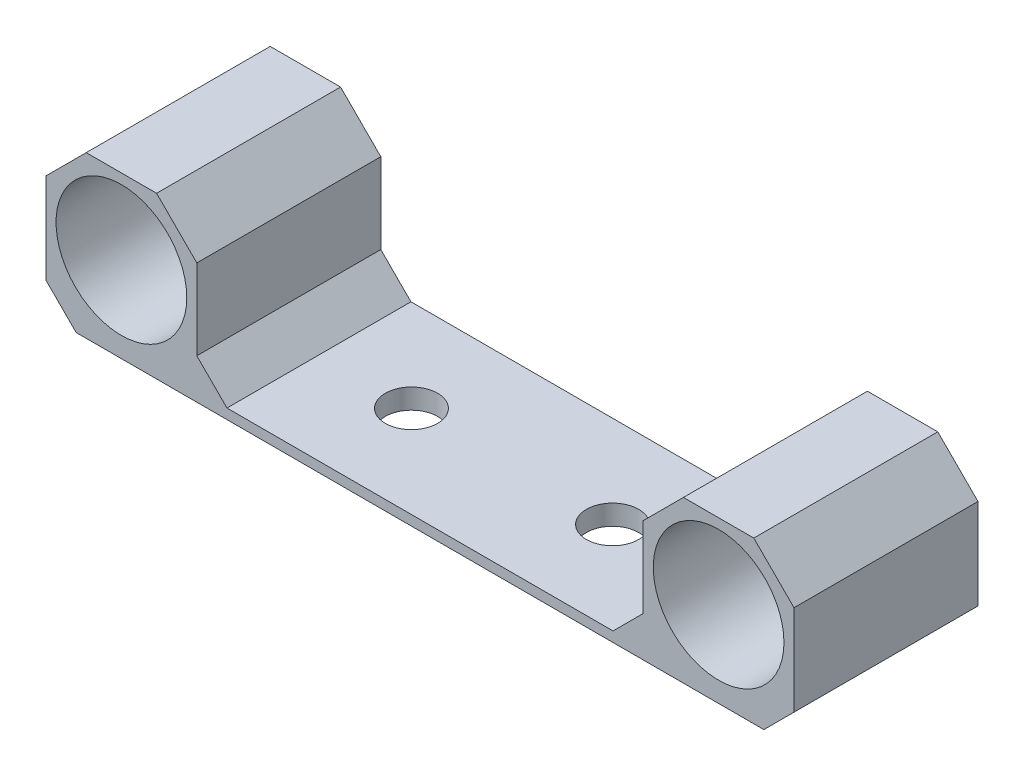
ISO-10303-21;
HEADER;
FILE_DESCRIPTION(('STEP AP214'),'2;1');
FILE_NAME('part.step','',(''),(''),'','','');
FILE_SCHEMA(('AUTOMOTIVE_DESIGN { 1 0 10303 214 1 1 1 1 }'));
ENDSEC;
DATA;
#1=APPLICATION_CONTEXT('core data for automotive mechanical design processes');
#2=APPLICATION_PROTOCOL_DEFINITION('international standard','automotive_design',2000,#1);
#3=PRODUCT_CONTEXT('',#1,'mechanical');
#4=PRODUCT('Part','Part','',(#3));
#5=PRODUCT_RELATED_PRODUCT_CATEGORY('part','',(#4));
#6=PRODUCT_DEFINITION_FORMATION('','',#4);
#7=PRODUCT_DEFINITION_CONTEXT('part definition',#1,'design');
#8=PRODUCT_DEFINITION('design','',#6,#7);
#9=PRODUCT_DEFINITION_SHAPE('','',#8);
#10=(LENGTH_UNIT() NAMED_UNIT(*) SI_UNIT(.MILLI.,.METRE.));
#11=(NAMED_UNIT(*) PLANE_ANGLE_UNIT() SI_UNIT($,.RADIAN.));
#12=(NAMED_UNIT(*) SI_UNIT($,.STERADIAN.) SOLID_ANGLE_UNIT());
#13=UNCERTAINTY_MEASURE_WITH_UNIT(LENGTH_MEASURE(1.E-05),#10,'distance_accuracy_value','');
#14=(GEOMETRIC_REPRESENTATION_CONTEXT(3) GLOBAL_UNCERTAINTY_ASSIGNED_CONTEXT((#13)) GLOBAL_UNIT_ASSIGNED_CONTEXT((#10,
#11,#12)) REPRESENTATION_CONTEXT('',''));
#15=CARTESIAN_POINT('',(0.,0.,0.));
#16=DIRECTION('',(0.,0.,1.));
#17=DIRECTION('',(1.,0.,0.));
#18=AXIS2_PLACEMENT_3D('',#15,#16,#17);
#19=CARTESIAN_POINT('',(0.,2.,0.));
#20=DIRECTION('',(0.,1.,0.));
#21=DIRECTION('',(0.,0.,1.));
#22=AXIS2_PLACEMENT_3D('',#19,#20,#21);
#23=PLANE('',#22);
#24=CARTESIAN_POINT('',(32.2,2.,-9.15));
#25=DIRECTION('',(0.,1.,0.));
#26=DIRECTION('',(0.,0.,1.));
#27=AXIS2_PLACEMENT_3D('',#24,#25,#26);
#28=CIRCLE('',#27,2.6);
#29=CARTESIAN_POINT('',(32.2,2.,-6.55));
#30=VERTEX_POINT('',#29);
#31=EDGE_CURVE('E411',#30,#30,#28,.T.);
#32=ORIENTED_EDGE('',*,*,#31,.F.);
#33=EDGE_LOOP('',(#32));
#34=FACE_BOUND('',#33,.T.);
#35=CARTESIAN_POINT('',(12.2,2.,-9.15));
#36=DIRECTION('',(0.,1.,0.));
#37=DIRECTION('',(0.,0.,1.));
#38=AXIS2_PLACEMENT_3D('',#35,#36,#37);
#39=CIRCLE('',#38,2.6);
#40=CARTESIAN_POINT('',(12.2,2.,-6.55));
#41=VERTEX_POINT('',#40);
#42=EDGE_CURVE('E415',#41,#41,#39,.T.);
#43=ORIENTED_EDGE('',*,*,#42,.F.);
#44=EDGE_LOOP('',(#43));
#45=FACE_BOUND('',#44,.T.);
#46=DIRECTION('',(-1.,0.,0.));
#47=VECTOR('',#46,1.);
#48=CARTESIAN_POINT('',(0.,2.,0.));
#49=LINE('',#48,#47);
#50=CARTESIAN_POINT('',(41.4,2.,0.));
#51=VERTEX_POINT('',#50);
#52=CARTESIAN_POINT('',(3.,2.,0.));
#53=VERTEX_POINT('',#52);
#54=EDGE_CURVE('E402',#51,#53,#49,.T.);
#55=ORIENTED_EDGE('',*,*,#54,.F.);
#56=DIRECTION('',(0.,0.,-1.));
#57=VECTOR('',#56,1.);
#58=CARTESIAN_POINT('',(41.4,2.,-18.3));
#59=LINE('',#58,#57);
#60=CARTESIAN_POINT('',(41.4,2.,-18.3));
#61=VERTEX_POINT('',#60);
#62=EDGE_CURVE('E298',#51,#61,#59,.T.);
#63=ORIENTED_EDGE('',*,*,#62,.T.);
#64=DIRECTION('',(-1.,0.,0.));
#65=VECTOR('',#64,1.);
#66=CARTESIAN_POINT('',(0.,2.,-18.3));
#67=LINE('',#66,#65);
#68=CARTESIAN_POINT('',(3.,2.,-18.3));
#69=VERTEX_POINT('',#68);
#70=EDGE_CURVE('E406',#61,#69,#67,.T.);
#71=ORIENTED_EDGE('',*,*,#70,.T.);
#72=DIRECTION('',(0.,0.,1.));
#73=VECTOR('',#72,1.);
#74=CARTESIAN_POINT('',(3.,2.,0.));
#75=LINE('',#74,#73);
#76=EDGE_CURVE('E294',#69,#53,#75,.T.);
#77=ORIENTED_EDGE('',*,*,#76,.T.);
#78=EDGE_LOOP('',(#55,#63,#71,#77));
#79=FACE_BOUND('',#78,.T.);
#80=ADVANCED_FACE('F59',(#34,#45,#79),#23,.T.);
#81=CARTESIAN_POINT('',(-15.,2.,0.));
#82=DIRECTION('',(-1.,0.,0.));
#83=DIRECTION('',(0.,0.,1.));
#84=AXIS2_PLACEMENT_3D('',#81,#82,#83);
#85=PLANE('',#84);
#86=DIRECTION('',(0.,-1.,0.));
#87=VECTOR('',#86,1.);
#88=CARTESIAN_POINT('',(-15.,2.,-18.3));
#89=LINE('',#88,#87);
#90=CARTESIAN_POINT('',(-15.,13.,-18.3));
#91=VERTEX_POINT('',#90);
#92=CARTESIAN_POINT('',(-15.,4.,-18.3));
#93=VERTEX_POINT('',#92);
#94=EDGE_CURVE('E211',#91,#93,#89,.T.);
#95=ORIENTED_EDGE('',*,*,#94,.T.);
#96=DIRECTION('',(0.,0.,1.));
#97=VECTOR('',#96,1.);
#98=CARTESIAN_POINT('',(-15.,4.,0.));
#99=LINE('',#98,#97);
#100=CARTESIAN_POINT('',(-15.,4.,0.));
#101=VERTEX_POINT('',#100);
#102=EDGE_CURVE('E277',#93,#101,#99,.T.);
#103=ORIENTED_EDGE('',*,*,#102,.T.);
#104=DIRECTION('',(0.,-1.,0.));
#105=VECTOR('',#104,1.);
#106=CARTESIAN_POINT('',(-15.,2.,0.));
#107=LINE('',#106,#105);
#108=CARTESIAN_POINT('',(-15.,13.,0.));
#109=VERTEX_POINT('',#108);
#110=EDGE_CURVE('E217',#109,#101,#107,.T.);
#111=ORIENTED_EDGE('',*,*,#110,.F.);
#112=DIRECTION('',(0.,0.,-1.));
#113=VECTOR('',#112,1.);
#114=CARTESIAN_POINT('',(-15.,13.,0.));
#115=LINE('',#114,#113);
#116=EDGE_CURVE('E273',#109,#91,#115,.T.);
#117=ORIENTED_EDGE('',*,*,#116,.T.);
#118=EDGE_LOOP('',(#95,#103,#111,#117));
#119=FACE_BOUND('',#118,.T.);
#120=ADVANCED_FACE('F359',(#119),#85,.T.);
#121=CARTESIAN_POINT('',(0.,2.,0.));
#122=DIRECTION('',(0.,0.,1.));
#123=DIRECTION('',(1.,0.,0.));
#124=AXIS2_PLACEMENT_3D('',#121,#122,#123);
#125=PLANE('',#124);
#126=CARTESIAN_POINT('',(-7.5,9.5,0.));
#127=DIRECTION('',(0.,0.,1.));
#128=DIRECTION('',(1.,0.,0.));
#129=AXIS2_PLACEMENT_3D('',#126,#127,#128);
#130=CIRCLE('',#129,6.5);
#131=CARTESIAN_POINT('',(-0.999999999999999,9.5,0.));
#132=VERTEX_POINT('',#131);
#133=EDGE_CURVE('E762',#132,#132,#130,.T.);
#134=ORIENTED_EDGE('',*,*,#133,.F.);
#135=EDGE_LOOP('',(#134));
#136=FACE_BOUND('',#135,.T.);
#137=CARTESIAN_POINT('',(51.9,9.5,0.));
#138=DIRECTION('',(0.,0.,1.));
#139=DIRECTION('',(1.,0.,0.));
#140=AXIS2_PLACEMENT_3D('',#137,#138,#139);
#141=CIRCLE('',#140,6.5);
#142=CARTESIAN_POINT('',(58.4,9.5,0.));
#143=VERTEX_POINT('',#142);
#144=EDGE_CURVE('E766',#143,#143,#141,.T.);
#145=ORIENTED_EDGE('',*,*,#144,.F.);
#146=EDGE_LOOP('',(#145));
#147=FACE_BOUND('',#146,.T.);
#148=DIRECTION('',(0.707106781186548,-0.707106781186548,0.));
#149=VECTOR('',#148,1.);
#150=CARTESIAN_POINT('',(-6.5,-4.5,0.));
#151=LINE('',#150,#149);
#152=CARTESIAN_POINT('',(-12.,1.00000000000001,0.));
#153=VERTEX_POINT('',#152);
#154=EDGE_CURVE('E252',#101,#153,#151,.T.);
#155=ORIENTED_EDGE('',*,*,#154,.T.);
#156=DIRECTION('',(1.,0.,0.));
#157=VECTOR('',#156,1.);
#158=CARTESIAN_POINT('',(55.4,1.00000000000001,0.));
#159=LINE('',#158,#157);
#160=CARTESIAN_POINT('',(56.4,1.00000000000001,0.));
#161=VERTEX_POINT('',#160);
#162=EDGE_CURVE('E14',#153,#161,#159,.T.);
#163=ORIENTED_EDGE('',*,*,#162,.T.);
#164=DIRECTION('',(-0.707106781186547,-0.707106781186548,0.));
#165=VECTOR('',#164,1.);
#166=CARTESIAN_POINT('',(28.7,-26.7,0.));
#167=LINE('',#166,#165);
#168=CARTESIAN_POINT('',(59.4,4.,0.));
#169=VERTEX_POINT('',#168);
#170=EDGE_CURVE('E260',#161,#169,#167,.F.);
#171=ORIENTED_EDGE('',*,*,#170,.T.);
#172=DIRECTION('',(0.,-1.,0.));
#173=VECTOR('',#172,1.);
#174=CARTESIAN_POINT('',(59.4,2.,0.));
#175=LINE('',#174,#173);
#176=CARTESIAN_POINT('',(59.4,13.,0.));
#177=VERTEX_POINT('',#176);
#178=EDGE_CURVE('E210',#177,#169,#175,.T.);
#179=ORIENTED_EDGE('',*,*,#178,.F.);
#180=DIRECTION('',(-0.707106781186547,0.707106781186548,0.));
#181=VECTOR('',#180,1.);
#182=CARTESIAN_POINT('',(35.2,37.2,0.));
#183=LINE('',#182,#181);
#184=CARTESIAN_POINT('',(55.4,17.,0.));
#185=VERTEX_POINT('',#184);
#186=EDGE_CURVE('E215',#177,#185,#183,.T.);
#187=ORIENTED_EDGE('',*,*,#186,.T.);
#188=DIRECTION('',(1.,0.,0.));
#189=VECTOR('',#188,1.);
#190=CARTESIAN_POINT('',(0.,17.,0.));
#191=LINE('',#190,#189);
#192=CARTESIAN_POINT('',(48.4,17.,0.));
#193=VERTEX_POINT('',#192);
#194=EDGE_CURVE('E387',#193,#185,#191,.T.);
#195=ORIENTED_EDGE('',*,*,#194,.F.);
#196=DIRECTION('',(0.707106781186547,0.707106781186548,0.));
#197=VECTOR('',#196,1.);
#198=CARTESIAN_POINT('',(16.7,-14.7,0.));
#199=LINE('',#198,#197);
#200=CARTESIAN_POINT('',(44.4,13.,0.));
#201=VERTEX_POINT('',#200);
#202=EDGE_CURVE('E255',#193,#201,#199,.F.);
#203=ORIENTED_EDGE('',*,*,#202,.T.);
#204=DIRECTION('',(0.,-1.,0.));
#205=VECTOR('',#204,1.);
#206=CARTESIAN_POINT('',(44.4,17.,0.));
#207=LINE('',#206,#205);
#208=CARTESIAN_POINT('',(44.4,5.,0.));
#209=VERTEX_POINT('',#208);
#210=EDGE_CURVE('E393',#201,#209,#207,.T.);
#211=ORIENTED_EDGE('',*,*,#210,.T.);
#212=DIRECTION('',(0.707106781186548,0.707106781186547,0.));
#213=VECTOR('',#212,1.);
#214=CARTESIAN_POINT('',(44.4,5.,0.));
#215=LINE('',#214,#213);
#216=EDGE_CURVE('E304',#209,#51,#215,.F.);
#217=ORIENTED_EDGE('',*,*,#216,.T.);
#218=ORIENTED_EDGE('',*,*,#54,.T.);
#219=DIRECTION('',(-0.707106781186547,0.707106781186548,0.));
#220=VECTOR('',#219,1.);
#221=CARTESIAN_POINT('',(3.,2.,0.));
#222=LINE('',#221,#220);
#223=CARTESIAN_POINT('',(0.,5.,0.));
#224=VERTEX_POINT('',#223);
#225=EDGE_CURVE('E310',#53,#224,#222,.T.);
#226=ORIENTED_EDGE('',*,*,#225,.T.);
#227=DIRECTION('',(0.,-1.,0.));
#228=VECTOR('',#227,1.);
#229=CARTESIAN_POINT('',(0.,17.,0.));
#230=LINE('',#229,#228);
#231=CARTESIAN_POINT('',(0.,13.,0.));
#232=VERTEX_POINT('',#231);
#233=EDGE_CURVE('E378',#232,#224,#230,.T.);
#234=ORIENTED_EDGE('',*,*,#233,.F.);
#235=DIRECTION('',(-0.707106781186548,0.707106781186548,0.));
#236=VECTOR('',#235,1.);
#237=CARTESIAN_POINT('',(5.5,7.5,0.));
#238=LINE('',#237,#236);
#239=CARTESIAN_POINT('',(-4.,17.,0.));
#240=VERTEX_POINT('',#239);
#241=EDGE_CURVE('E249',#232,#240,#238,.T.);
#242=ORIENTED_EDGE('',*,*,#241,.T.);
#243=DIRECTION('',(-1.,0.,0.));
#244=VECTOR('',#243,1.);
#245=CARTESIAN_POINT('',(0.,17.,0.));
#246=LINE('',#245,#244);
#247=CARTESIAN_POINT('',(-11.,17.,0.));
#248=VERTEX_POINT('',#247);
#249=EDGE_CURVE('E373',#240,#248,#246,.T.);
#250=ORIENTED_EDGE('',*,*,#249,.T.);
#251=DIRECTION('',(0.707106781186548,0.707106781186548,0.));
#252=VECTOR('',#251,1.);
#253=CARTESIAN_POINT('',(-13.,15.,0.));
#254=LINE('',#253,#252);
#255=EDGE_CURVE('E246',#248,#109,#254,.F.);
#256=ORIENTED_EDGE('',*,*,#255,.T.);
#257=ORIENTED_EDGE('',*,*,#110,.T.);
#258=EDGE_LOOP('',(#155,#163,#171,#179,#187,#195,#203,#211,#217,#218,#226,#234,#242,#250,#256,#257));
#259=FACE_BOUND('',#258,.T.);
#260=ADVANCED_FACE('F352',(#136,#147,#259),#125,.T.);
#261=CARTESIAN_POINT('',(59.4,2.,0.));
#262=DIRECTION('',(-1.,0.,0.));
#263=DIRECTION('',(0.,0.,1.));
#264=AXIS2_PLACEMENT_3D('',#261,#262,#263);
#265=PLANE('',#264);
#266=ORIENTED_EDGE('',*,*,#178,.T.);
#267=DIRECTION('',(0.,0.,-1.));
#268=VECTOR('',#267,1.);
#269=CARTESIAN_POINT('',(59.4,4.,0.));
#270=LINE('',#269,#268);
#271=CARTESIAN_POINT('',(59.4,4.,-18.3));
#272=VERTEX_POINT('',#271);
#273=EDGE_CURVE('E208',#169,#272,#270,.T.);
#274=ORIENTED_EDGE('',*,*,#273,.T.);
#275=DIRECTION('',(0.,-1.,0.));
#276=VECTOR('',#275,1.);
#277=CARTESIAN_POINT('',(59.4,2.,-18.3));
#278=LINE('',#277,#276);
#279=CARTESIAN_POINT('',(59.4,13.,-18.3));
#280=VERTEX_POINT('',#279);
#281=EDGE_CURVE('E190',#280,#272,#278,.T.);
#282=ORIENTED_EDGE('',*,*,#281,.F.);
#283=DIRECTION('',(0.,0.,1.));
#284=VECTOR('',#283,1.);
#285=CARTESIAN_POINT('',(59.4,13.,0.));
#286=LINE('',#285,#284);
#287=EDGE_CURVE('E205',#280,#177,#286,.T.);
#288=ORIENTED_EDGE('',*,*,#287,.T.);
#289=EDGE_LOOP('',(#266,#274,#282,#288));
#290=FACE_BOUND('',#289,.T.);
#291=ADVANCED_FACE('F204',(#290),#265,.F.);
#292=CARTESIAN_POINT('',(32.2,2.,-9.15));
#293=DIRECTION('',(0.,-1.,0.));
#294=DIRECTION('',(0.,0.,-1.));
#295=AXIS2_PLACEMENT_3D('',#292,#293,#294);
#296=CYLINDRICAL_SURFACE('',#295,2.6);
#297=ORIENTED_EDGE('',*,*,#31,.T.);
#298=EDGE_LOOP('',(#297));
#299=FACE_BOUND('',#298,.T.);
#300=CARTESIAN_POINT('',(32.2,0.,-9.15));
#301=DIRECTION('',(0.,1.,0.));
#302=DIRECTION('',(0.,0.,1.));
#303=AXIS2_PLACEMENT_3D('',#300,#301,#302);
#304=CIRCLE('',#303,2.6);
#305=CARTESIAN_POINT('',(32.2,0.,-6.55));
#306=VERTEX_POINT('',#305);
#307=EDGE_CURVE('E401',#306,#306,#304,.T.);
#308=ORIENTED_EDGE('',*,*,#307,.F.);
#309=EDGE_LOOP('',(#308));
#310=FACE_BOUND('',#309,.T.);
#311=ADVANCED_FACE('F489',(#299,#310),#296,.F.);
#312=CARTESIAN_POINT('',(0.,2.,-18.3));
#313=DIRECTION('',(0.,0.,1.));
#314=DIRECTION('',(1.,0.,0.));
#315=AXIS2_PLACEMENT_3D('',#312,#313,#314);
#316=PLANE('',#315);
#317=DIRECTION('',(0.707106781186547,0.707106781186548,0.));
#318=VECTOR('',#317,1.);
#319=CARTESIAN_POINT('',(59.4,4.,-18.3));
#320=LINE('',#319,#318);
#321=CARTESIAN_POINT('',(56.4,1.00000000000001,-18.3));
#322=VERTEX_POINT('',#321);
#323=EDGE_CURVE('E198',#272,#322,#320,.F.);
#324=ORIENTED_EDGE('',*,*,#323,.T.);
#325=DIRECTION('',(-1.,0.,0.));
#326=VECTOR('',#325,1.);
#327=CARTESIAN_POINT('',(0.,1.00000000000001,-18.3));
#328=LINE('',#327,#326);
#329=CARTESIAN_POINT('',(-12.,1.00000000000002,-18.3));
#330=VERTEX_POINT('',#329);
#331=EDGE_CURVE('E316',#322,#330,#328,.T.);
#332=ORIENTED_EDGE('',*,*,#331,.T.);
#333=DIRECTION('',(-0.707106781186548,0.707106781186548,0.));
#334=VECTOR('',#333,1.);
#335=CARTESIAN_POINT('',(-11.,0.,-18.3));
#336=LINE('',#335,#334);
#337=EDGE_CURVE('E232',#330,#93,#336,.T.);
#338=ORIENTED_EDGE('',*,*,#337,.T.);
#339=ORIENTED_EDGE('',*,*,#94,.F.);
#340=DIRECTION('',(-0.707106781186548,-0.707106781186548,0.));
#341=VECTOR('',#340,1.);
#342=CARTESIAN_POINT('',(-15.,13.,-18.3));
#343=LINE('',#342,#341);
#344=CARTESIAN_POINT('',(-11.,17.,-18.3));
#345=VERTEX_POINT('',#344);
#346=EDGE_CURVE('E221',#91,#345,#343,.F.);
#347=ORIENTED_EDGE('',*,*,#346,.T.);
#348=DIRECTION('',(-1.,0.,0.));
#349=VECTOR('',#348,1.);
#350=CARTESIAN_POINT('',(0.,17.,-18.3));
#351=LINE('',#350,#349);
#352=CARTESIAN_POINT('',(-4.,17.,-18.3));
#353=VERTEX_POINT('',#352);
#354=EDGE_CURVE('E366',#353,#345,#351,.T.);
#355=ORIENTED_EDGE('',*,*,#354,.F.);
#356=DIRECTION('',(0.707106781186548,-0.707106781186548,0.));
#357=VECTOR('',#356,1.);
#358=CARTESIAN_POINT('',(-4.,17.,-18.3));
#359=LINE('',#358,#357);
#360=CARTESIAN_POINT('',(0.,13.,-18.3));
#361=VERTEX_POINT('',#360);
#362=EDGE_CURVE('E229',#353,#361,#359,.T.);
#363=ORIENTED_EDGE('',*,*,#362,.T.);
#364=DIRECTION('',(0.,-1.,0.));
#365=VECTOR('',#364,1.);
#366=CARTESIAN_POINT('',(0.,17.,-18.3));
#367=LINE('',#366,#365);
#368=CARTESIAN_POINT('',(0.,5.,-18.3));
#369=VERTEX_POINT('',#368);
#370=EDGE_CURVE('E372',#361,#369,#367,.T.);
#371=ORIENTED_EDGE('',*,*,#370,.T.);
#372=DIRECTION('',(0.707106781186547,-0.707106781186548,0.));
#373=VECTOR('',#372,1.);
#374=CARTESIAN_POINT('',(1.5,3.5,-18.3));
#375=LINE('',#374,#373);
#376=EDGE_CURVE('E313',#369,#69,#375,.T.);
#377=ORIENTED_EDGE('',*,*,#376,.T.);
#378=ORIENTED_EDGE('',*,*,#70,.F.);
#379=DIRECTION('',(-0.707106781186548,-0.707106781186547,0.));
#380=VECTOR('',#379,1.);
#381=CARTESIAN_POINT('',(20.7,-18.7,-18.3));
#382=LINE('',#381,#380);
#383=CARTESIAN_POINT('',(44.4,5.,-18.3));
#384=VERTEX_POINT('',#383);
#385=EDGE_CURVE('E307',#61,#384,#382,.F.);
#386=ORIENTED_EDGE('',*,*,#385,.T.);
#387=DIRECTION('',(0.,-1.,0.));
#388=VECTOR('',#387,1.);
#389=CARTESIAN_POINT('',(44.4,17.,-18.3));
#390=LINE('',#389,#388);
#391=CARTESIAN_POINT('',(44.4,13.,-18.3));
#392=VERTEX_POINT('',#391);
#393=EDGE_CURVE('E397',#392,#384,#390,.T.);
#394=ORIENTED_EDGE('',*,*,#393,.F.);
#395=DIRECTION('',(-0.707106781186547,-0.707106781186548,0.));
#396=VECTOR('',#395,1.);
#397=CARTESIAN_POINT('',(44.4,13.,-18.3));
#398=LINE('',#397,#396);
#399=CARTESIAN_POINT('',(48.4,17.,-18.3));
#400=VERTEX_POINT('',#399);
#401=EDGE_CURVE('E199',#392,#400,#398,.F.);
#402=ORIENTED_EDGE('',*,*,#401,.T.);
#403=DIRECTION('',(1.,0.,0.));
#404=VECTOR('',#403,1.);
#405=CARTESIAN_POINT('',(0.,17.,-18.3));
#406=LINE('',#405,#404);
#407=CARTESIAN_POINT('',(55.4,17.,-18.3));
#408=VERTEX_POINT('',#407);
#409=EDGE_CURVE('E192',#400,#408,#406,.T.);
#410=ORIENTED_EDGE('',*,*,#409,.T.);
#411=DIRECTION('',(0.707106781186547,-0.707106781186548,0.));
#412=VECTOR('',#411,1.);
#413=CARTESIAN_POINT('',(55.4,17.,-18.3));
#414=LINE('',#413,#412);
#415=EDGE_CURVE('E186',#408,#280,#414,.T.);
#416=ORIENTED_EDGE('',*,*,#415,.T.);
#417=ORIENTED_EDGE('',*,*,#281,.T.);
#418=EDGE_LOOP('',(#324,#332,#338,#339,#347,#355,#363,#371,#377,#378,#386,#394,#402,#410,#416,#417));
#419=FACE_BOUND('',#418,.T.);
#420=ADVANCED_FACE('F189',(#419),#316,.F.);
#421=CARTESIAN_POINT('',(12.2,2.,-9.15));
#422=DIRECTION('',(0.,-1.,0.));
#423=DIRECTION('',(0.,0.,-1.));
#424=AXIS2_PLACEMENT_3D('',#421,#422,#423);
#425=CYLINDRICAL_SURFACE('',#424,2.6);
#426=ORIENTED_EDGE('',*,*,#42,.T.);
#427=EDGE_LOOP('',(#426));
#428=FACE_BOUND('',#427,.T.);
#429=CARTESIAN_POINT('',(12.2,0.,-9.15));
#430=DIRECTION('',(0.,1.,0.));
#431=DIRECTION('',(0.,0.,1.));
#432=AXIS2_PLACEMENT_3D('',#429,#430,#431);
#433=CIRCLE('',#432,2.6);
#434=CARTESIAN_POINT('',(12.2,0.,-6.55));
#435=VERTEX_POINT('',#434);
#436=EDGE_CURVE('E407',#435,#435,#433,.T.);
#437=ORIENTED_EDGE('',*,*,#436,.F.);
#438=EDGE_LOOP('',(#437));
#439=FACE_BOUND('',#438,.T.);
#440=ADVANCED_FACE('F485',(#428,#439),#425,.F.);
#441=CARTESIAN_POINT('',(0.,0.,0.));
#442=DIRECTION('',(0.,1.,0.));
#443=DIRECTION('',(0.,0.,1.));
#444=AXIS2_PLACEMENT_3D('',#441,#442,#443);
#445=PLANE('',#444);
#446=DIRECTION('',(0.,0.,-1.));
#447=VECTOR('',#446,1.);
#448=CARTESIAN_POINT('',(-11.,0.,-18.3));
#449=LINE('',#448,#447);
#450=CARTESIAN_POINT('',(-11.,0.,-1.));
#451=VERTEX_POINT('',#450);
#452=CARTESIAN_POINT('',(-11.,0.,-17.3));
#453=VERTEX_POINT('',#452);
#454=EDGE_CURVE('E239',#451,#453,#449,.T.);
#455=ORIENTED_EDGE('',*,*,#454,.T.);
#456=DIRECTION('',(1.,0.,0.));
#457=VECTOR('',#456,1.);
#458=CARTESIAN_POINT('',(0.,0.,-17.3));
#459=LINE('',#458,#457);
#460=CARTESIAN_POINT('',(55.4,0.,-17.3));
#461=VERTEX_POINT('',#460);
#462=EDGE_CURVE('E330',#453,#461,#459,.T.);
#463=ORIENTED_EDGE('',*,*,#462,.T.);
#464=DIRECTION('',(0.,0.,1.));
#465=VECTOR('',#464,1.);
#466=CARTESIAN_POINT('',(55.4,0.,0.));
#467=LINE('',#466,#465);
#468=CARTESIAN_POINT('',(55.4,0.,-1.00000000000001));
#469=VERTEX_POINT('',#468);
#470=EDGE_CURVE('E243',#461,#469,#467,.T.);
#471=ORIENTED_EDGE('',*,*,#470,.T.);
#472=DIRECTION('',(-1.,0.,0.));
#473=VECTOR('',#472,1.);
#474=CARTESIAN_POINT('',(-11.,0.,-1.));
#475=LINE('',#474,#473);
#476=EDGE_CURVE('E326',#469,#451,#475,.T.);
#477=ORIENTED_EDGE('',*,*,#476,.T.);
#478=EDGE_LOOP('',(#455,#463,#471,#477));
#479=FACE_BOUND('',#478,.T.);
#480=ORIENTED_EDGE('',*,*,#436,.T.);
#481=EDGE_LOOP('',(#480));
#482=FACE_BOUND('',#481,.T.);
#483=ORIENTED_EDGE('',*,*,#307,.T.);
#484=EDGE_LOOP('',(#483));
#485=FACE_BOUND('',#484,.T.);
#486=ADVANCED_FACE('F347',(#479,#482,#485),#445,.F.);
#487=CARTESIAN_POINT('',(44.4,17.,0.));
#488=DIRECTION('',(-1.,0.,0.));
#489=DIRECTION('',(0.,0.,1.));
#490=AXIS2_PLACEMENT_3D('',#487,#488,#489);
#491=PLANE('',#490);
#492=ORIENTED_EDGE('',*,*,#393,.T.);
#493=DIRECTION('',(0.,0.,1.));
#494=VECTOR('',#493,1.);
#495=CARTESIAN_POINT('',(44.4,5.,0.));
#496=LINE('',#495,#494);
#497=EDGE_CURVE('E290',#384,#209,#496,.T.);
#498=ORIENTED_EDGE('',*,*,#497,.T.);
#499=ORIENTED_EDGE('',*,*,#210,.F.);
#500=DIRECTION('',(0.,0.,-1.));
#501=VECTOR('',#500,1.);
#502=CARTESIAN_POINT('',(44.4,13.,0.));
#503=LINE('',#502,#501);
#504=EDGE_CURVE('E269',#201,#392,#503,.T.);
#505=ORIENTED_EDGE('',*,*,#504,.T.);
#506=EDGE_LOOP('',(#492,#498,#499,#505));
#507=FACE_BOUND('',#506,.T.);
#508=ADVANCED_FACE('F437',(#507),#491,.T.);
#509=CARTESIAN_POINT('',(0.,17.,0.));
#510=DIRECTION('',(0.,1.,0.));
#511=DIRECTION('',(0.,0.,1.));
#512=AXIS2_PLACEMENT_3D('',#509,#510,#511);
#513=PLANE('',#512);
#514=ORIENTED_EDGE('',*,*,#194,.T.);
#515=DIRECTION('',(0.,0.,-1.));
#516=VECTOR('',#515,1.);
#517=CARTESIAN_POINT('',(55.4,17.,-18.3));
#518=LINE('',#517,#516);
#519=EDGE_CURVE('E266',#185,#408,#518,.T.);
#520=ORIENTED_EDGE('',*,*,#519,.T.);
#521=ORIENTED_EDGE('',*,*,#409,.F.);
#522=DIRECTION('',(0.,0.,1.));
#523=VECTOR('',#522,1.);
#524=CARTESIAN_POINT('',(48.4,17.,0.));
#525=LINE('',#524,#523);
#526=EDGE_CURVE('E263',#400,#193,#525,.T.);
#527=ORIENTED_EDGE('',*,*,#526,.T.);
#528=EDGE_LOOP('',(#514,#520,#521,#527));
#529=FACE_BOUND('',#528,.T.);
#530=ADVANCED_FACE('F430',(#529),#513,.T.);
#531=CARTESIAN_POINT('',(0.,17.,0.));
#532=DIRECTION('',(-1.,0.,0.));
#533=DIRECTION('',(0.,0.,1.));
#534=AXIS2_PLACEMENT_3D('',#531,#532,#533);
#535=PLANE('',#534);
#536=ORIENTED_EDGE('',*,*,#233,.T.);
#537=DIRECTION('',(0.,0.,-1.));
#538=VECTOR('',#537,1.);
#539=CARTESIAN_POINT('',(0.,5.,0.));
#540=LINE('',#539,#538);
#541=EDGE_CURVE('E301',#224,#369,#540,.T.);
#542=ORIENTED_EDGE('',*,*,#541,.T.);
#543=ORIENTED_EDGE('',*,*,#370,.F.);
#544=DIRECTION('',(0.,0.,1.));
#545=VECTOR('',#544,1.);
#546=CARTESIAN_POINT('',(0.,13.,0.));
#547=LINE('',#546,#545);
#548=EDGE_CURVE('E287',#361,#232,#547,.T.);
#549=ORIENTED_EDGE('',*,*,#548,.T.);
#550=EDGE_LOOP('',(#536,#542,#543,#549));
#551=FACE_BOUND('',#550,.T.);
#552=ADVANCED_FACE('F455',(#551),#535,.F.);
#553=CARTESIAN_POINT('',(0.,17.,0.));
#554=DIRECTION('',(0.,1.,0.));
#555=DIRECTION('',(0.,0.,1.));
#556=AXIS2_PLACEMENT_3D('',#553,#554,#555);
#557=PLANE('',#556);
#558=ORIENTED_EDGE('',*,*,#249,.F.);
#559=DIRECTION('',(0.,0.,-1.));
#560=VECTOR('',#559,1.);
#561=CARTESIAN_POINT('',(-4.,17.,-18.3));
#562=LINE('',#561,#560);
#563=EDGE_CURVE('E283',#240,#353,#562,.T.);
#564=ORIENTED_EDGE('',*,*,#563,.T.);
#565=ORIENTED_EDGE('',*,*,#354,.T.);
#566=DIRECTION('',(0.,0.,1.));
#567=VECTOR('',#566,1.);
#568=CARTESIAN_POINT('',(-11.,17.,0.));
#569=LINE('',#568,#567);
#570=EDGE_CURVE('E280',#345,#248,#569,.T.);
#571=ORIENTED_EDGE('',*,*,#570,.T.);
#572=EDGE_LOOP('',(#558,#564,#565,#571));
#573=FACE_BOUND('',#572,.T.);
#574=ADVANCED_FACE('F369',(#573),#557,.T.);
#575=CARTESIAN_POINT('',(51.9,9.5,-36.6847763108503));
#576=DIRECTION('',(0.,0.,1.));
#577=DIRECTION('',(1.,0.,0.));
#578=AXIS2_PLACEMENT_3D('',#575,#576,#577);
#579=CYLINDRICAL_SURFACE('',#578,6.5);
#580=CARTESIAN_POINT('',(51.9,9.5,-12.315));
#581=DIRECTION('',(0.,0.,1.));
#582=DIRECTION('',(1.,0.,0.));
#583=AXIS2_PLACEMENT_3D('',#580,#581,#582);
#584=CIRCLE('',#583,6.5);
#585=CARTESIAN_POINT('',(58.4,9.5,-12.315));
#586=VERTEX_POINT('',#585);
#587=EDGE_CURVE('E769',#586,#586,#584,.F.);
#588=ORIENTED_EDGE('',*,*,#587,.T.);
#589=EDGE_LOOP('',(#588));
#590=FACE_BOUND('',#589,.T.);
#591=ORIENTED_EDGE('',*,*,#144,.T.);
#592=EDGE_LOOP('',(#591));
#593=FACE_BOUND('',#592,.T.);
#594=ADVANCED_FACE('F581',(#590,#593),#579,.F.);
#595=CARTESIAN_POINT('',(0.,2.,-12.315));
#596=DIRECTION('',(0.,0.,1.));
#597=DIRECTION('',(1.,0.,0.));
#598=AXIS2_PLACEMENT_3D('',#595,#596,#597);
#599=PLANE('',#598);
#600=ORIENTED_EDGE('',*,*,#587,.F.);
#601=EDGE_LOOP('',(#600));
#602=FACE_BOUND('',#601,.T.);
#603=ADVANCED_FACE('F589',(#602),#599,.T.);
#604=CARTESIAN_POINT('',(-7.5,9.5,-36.6847763108503));
#605=DIRECTION('',(0.,0.,1.));
#606=DIRECTION('',(1.,0.,0.));
#607=AXIS2_PLACEMENT_3D('',#604,#605,#606);
#608=CYLINDRICAL_SURFACE('',#607,6.5);
#609=CARTESIAN_POINT('',(-7.5,9.5,-12.315));
#610=DIRECTION('',(0.,0.,1.));
#611=DIRECTION('',(1.,0.,0.));
#612=AXIS2_PLACEMENT_3D('',#609,#610,#611);
#613=CIRCLE('',#612,6.5);
#614=CARTESIAN_POINT('',(-0.999999999999999,9.5,-12.315));
#615=VERTEX_POINT('',#614);
#616=EDGE_CURVE('E380',#615,#615,#613,.F.);
#617=ORIENTED_EDGE('',*,*,#616,.T.);
#618=EDGE_LOOP('',(#617));
#619=FACE_BOUND('',#618,.T.);
#620=ORIENTED_EDGE('',*,*,#133,.T.);
#621=EDGE_LOOP('',(#620));
#622=FACE_BOUND('',#621,.T.);
#623=ADVANCED_FACE('F598',(#619,#622),#608,.F.);
#624=CARTESIAN_POINT('',(0.,2.,-12.315));
#625=DIRECTION('',(0.,0.,1.));
#626=DIRECTION('',(1.,0.,0.));
#627=AXIS2_PLACEMENT_3D('',#624,#625,#626);
#628=PLANE('',#627);
#629=ORIENTED_EDGE('',*,*,#616,.F.);
#630=EDGE_LOOP('',(#629));
#631=FACE_BOUND('',#630,.T.);
#632=ADVANCED_FACE('F506',(#631),#628,.T.);
#633=CARTESIAN_POINT('',(59.4,4.,0.));
#634=DIRECTION('',(-0.707106781186548,0.707106781186547,0.));
#635=DIRECTION('',(0.,0.,-1.));
#636=AXIS2_PLACEMENT_3D('',#633,#634,#635);
#637=PLANE('',#636);
#638=ORIENTED_EDGE('',*,*,#470,.F.);
#639=DIRECTION('',(0.577350269189623,0.577350269189624,-0.57735026918963));
#640=VECTOR('',#639,1.);
#641=CARTESIAN_POINT('',(52.3,-3.10000000000004,-14.1999999999999));
#642=LINE('',#641,#640);
#643=EDGE_CURVE('E69',#461,#322,#642,.T.);
#644=ORIENTED_EDGE('',*,*,#643,.T.);
#645=ORIENTED_EDGE('',*,*,#323,.F.);
#646=ORIENTED_EDGE('',*,*,#273,.F.);
#647=ORIENTED_EDGE('',*,*,#170,.F.);
#648=DIRECTION('',(0.577350269189627,0.577350269189627,0.577350269189623));
#649=VECTOR('',#648,1.);
#650=CARTESIAN_POINT('',(58.4,3.00000000000001,1.99999999999998));
#651=LINE('',#650,#649);
#652=EDGE_CURVE('E81',#161,#469,#651,.F.);
#653=ORIENTED_EDGE('',*,*,#652,.T.);
#654=EDGE_LOOP('',(#638,#644,#645,#646,#647,#653));
#655=FACE_BOUND('',#654,.T.);
#656=ADVANCED_FACE('F336',(#655),#637,.F.);
#657=CARTESIAN_POINT('',(55.4,17.,0.));
#658=DIRECTION('',(0.707106781186548,0.707106781186547,0.));
#659=DIRECTION('',(0.,0.,1.));
#660=AXIS2_PLACEMENT_3D('',#657,#658,#659);
#661=PLANE('',#660);
#662=ORIENTED_EDGE('',*,*,#186,.F.);
#663=ORIENTED_EDGE('',*,*,#287,.F.);
#664=ORIENTED_EDGE('',*,*,#415,.F.);
#665=ORIENTED_EDGE('',*,*,#519,.F.);
#666=EDGE_LOOP('',(#662,#663,#664,#665));
#667=FACE_BOUND('',#666,.T.);
#668=ADVANCED_FACE('F214',(#667),#661,.T.);
#669=CARTESIAN_POINT('',(44.4,13.,0.));
#670=DIRECTION('',(0.707106781186548,-0.707106781186547,0.));
#671=DIRECTION('',(0.,0.,-1.));
#672=AXIS2_PLACEMENT_3D('',#669,#670,#671);
#673=PLANE('',#672);
#674=ORIENTED_EDGE('',*,*,#202,.F.);
#675=ORIENTED_EDGE('',*,*,#526,.F.);
#676=ORIENTED_EDGE('',*,*,#401,.F.);
#677=ORIENTED_EDGE('',*,*,#504,.F.);
#678=EDGE_LOOP('',(#674,#675,#676,#677));
#679=FACE_BOUND('',#678,.T.);
#680=ADVANCED_FACE('F433',(#679),#673,.F.);
#681=CARTESIAN_POINT('',(-11.,0.,0.));
#682=DIRECTION('',(-0.707106781186548,-0.707106781186548,0.));
#683=DIRECTION('',(0.,0.,1.));
#684=AXIS2_PLACEMENT_3D('',#681,#682,#683);
#685=PLANE('',#684);
#686=ORIENTED_EDGE('',*,*,#337,.F.);
#687=DIRECTION('',(-0.577350269189624,0.577350269189624,-0.57735026918963));
#688=VECTOR('',#687,1.);
#689=CARTESIAN_POINT('',(-5.23333333333332,-5.76666666666668,-11.5333333333332));
#690=LINE('',#689,#688);
#691=EDGE_CURVE('E323',#330,#453,#690,.F.);
#692=ORIENTED_EDGE('',*,*,#691,.T.);
#693=ORIENTED_EDGE('',*,*,#454,.F.);
#694=DIRECTION('',(-0.577350269189627,0.577350269189627,0.577350269189623));
#695=VECTOR('',#694,1.);
#696=CARTESIAN_POINT('',(-11.3333333333333,0.333333333333332,-0.666666666666669));
#697=LINE('',#696,#695);
#698=EDGE_CURVE('E320',#451,#153,#697,.T.);
#699=ORIENTED_EDGE('',*,*,#698,.T.);
#700=ORIENTED_EDGE('',*,*,#154,.F.);
#701=ORIENTED_EDGE('',*,*,#102,.F.);
#702=EDGE_LOOP('',(#686,#692,#693,#699,#700,#701));
#703=FACE_BOUND('',#702,.T.);
#704=ADVANCED_FACE('F344',(#703),#685,.T.);
#705=CARTESIAN_POINT('',(-4.,17.,0.));
#706=DIRECTION('',(0.707106781186548,0.707106781186548,0.));
#707=DIRECTION('',(0.,0.,1.));
#708=AXIS2_PLACEMENT_3D('',#705,#706,#707);
#709=PLANE('',#708);
#710=ORIENTED_EDGE('',*,*,#241,.F.);
#711=ORIENTED_EDGE('',*,*,#548,.F.);
#712=ORIENTED_EDGE('',*,*,#362,.F.);
#713=ORIENTED_EDGE('',*,*,#563,.F.);
#714=EDGE_LOOP('',(#710,#711,#712,#713));
#715=FACE_BOUND('',#714,.T.);
#716=ADVANCED_FACE('F459',(#715),#709,.T.);
#717=CARTESIAN_POINT('',(-15.,13.,0.));
#718=DIRECTION('',(0.707106781186548,-0.707106781186548,0.));
#719=DIRECTION('',(0.,0.,-1.));
#720=AXIS2_PLACEMENT_3D('',#717,#718,#719);
#721=PLANE('',#720);
#722=ORIENTED_EDGE('',*,*,#255,.F.);
#723=ORIENTED_EDGE('',*,*,#570,.F.);
#724=ORIENTED_EDGE('',*,*,#346,.F.);
#725=ORIENTED_EDGE('',*,*,#116,.F.);
#726=EDGE_LOOP('',(#722,#723,#724,#725));
#727=FACE_BOUND('',#726,.T.);
#728=ADVANCED_FACE('F362',(#727),#721,.F.);
#729=CARTESIAN_POINT('',(44.4,5.,0.));
#730=DIRECTION('',(-0.707106781186547,0.707106781186548,0.));
#731=DIRECTION('',(0.,0.,-1.));
#732=AXIS2_PLACEMENT_3D('',#729,#730,#731);
#733=PLANE('',#732);
#734=ORIENTED_EDGE('',*,*,#385,.F.);
#735=ORIENTED_EDGE('',*,*,#62,.F.);
#736=ORIENTED_EDGE('',*,*,#216,.F.);
#737=ORIENTED_EDGE('',*,*,#497,.F.);
#738=EDGE_LOOP('',(#734,#735,#736,#737));
#739=FACE_BOUND('',#738,.T.);
#740=ADVANCED_FACE('F442',(#739),#733,.T.);
#741=CARTESIAN_POINT('',(3.,2.,0.));
#742=DIRECTION('',(-0.707106781186548,-0.707106781186547,0.));
#743=DIRECTION('',(0.,0.,1.));
#744=AXIS2_PLACEMENT_3D('',#741,#742,#743);
#745=PLANE('',#744);
#746=ORIENTED_EDGE('',*,*,#376,.F.);
#747=ORIENTED_EDGE('',*,*,#541,.F.);
#748=ORIENTED_EDGE('',*,*,#225,.F.);
#749=ORIENTED_EDGE('',*,*,#76,.F.);
#750=EDGE_LOOP('',(#746,#747,#748,#749));
#751=FACE_BOUND('',#750,.T.);
#752=ADVANCED_FACE('F450',(#751),#745,.F.);
#753=CARTESIAN_POINT('',(0.,1.00000000000001,-18.3));
#754=DIRECTION('',(0.,0.707106781186551,0.707106781186544));
#755=DIRECTION('',(-1.,0.,0.));
#756=AXIS2_PLACEMENT_3D('',#753,#754,#755);
#757=PLANE('',#756);
#758=ORIENTED_EDGE('',*,*,#643,.F.);
#759=ORIENTED_EDGE('',*,*,#462,.F.);
#760=ORIENTED_EDGE('',*,*,#691,.F.);
#761=ORIENTED_EDGE('',*,*,#331,.F.);
#762=EDGE_LOOP('',(#758,#759,#760,#761));
#763=FACE_BOUND('',#762,.T.);
#764=ADVANCED_FACE('F341',(#763),#757,.F.);
#765=CARTESIAN_POINT('',(0.,0.,-1.));
#766=DIRECTION('',(0.,-0.707106781186545,0.70710678118655));
#767=DIRECTION('',(1.,0.,0.));
#768=AXIS2_PLACEMENT_3D('',#765,#766,#767);
#769=PLANE('',#768);
#770=ORIENTED_EDGE('',*,*,#652,.F.);
#771=ORIENTED_EDGE('',*,*,#162,.F.);
#772=ORIENTED_EDGE('',*,*,#698,.F.);
#773=ORIENTED_EDGE('',*,*,#476,.F.);
#774=EDGE_LOOP('',(#770,#771,#772,#773));
#775=FACE_BOUND('',#774,.T.);
#776=ADVANCED_FACE('F62',(#775),#769,.T.);
#777=CLOSED_SHELL('',(#80,#120,#260,#291,#311,#420,#440,#486,#508,#530,#552,#574,#594,#603,#623,
#632,#656,#668,#680,#704,#716,#728,#740,#752,#764,#776));
#778=MANIFOLD_SOLID_BREP('B2',#777);
#779=ADVANCED_BREP_SHAPE_REPRESENTATION('',(#18,#778),#14);
#780=SHAPE_DEFINITION_REPRESENTATION(#9,#779);
ENDSEC;
END-ISO-10303-21;
